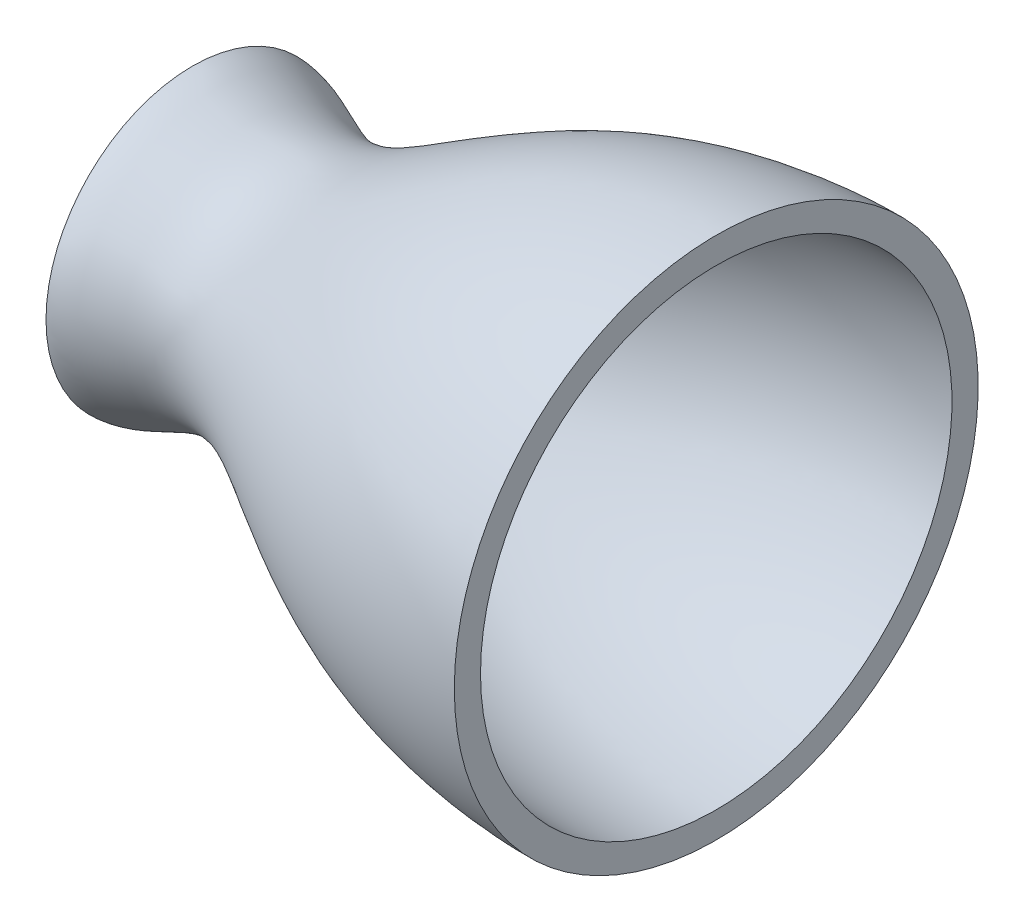
ISO-10303-21;
HEADER;
FILE_DESCRIPTION(('STEP AP214'),'2;1');
FILE_NAME('part.step','',(''),(''),'','','');
FILE_SCHEMA(('AUTOMOTIVE_DESIGN { 1 0 10303 214 1 1 1 1 }'));
ENDSEC;
DATA;
#1=APPLICATION_CONTEXT('core data for automotive mechanical design processes');
#2=APPLICATION_PROTOCOL_DEFINITION('international standard','automotive_design',2000,#1);
#3=PRODUCT_CONTEXT('',#1,'mechanical');
#4=PRODUCT('Part','Part','',(#3));
#5=PRODUCT_RELATED_PRODUCT_CATEGORY('part','',(#4));
#6=PRODUCT_DEFINITION_FORMATION('','',#4);
#7=PRODUCT_DEFINITION_CONTEXT('part definition',#1,'design');
#8=PRODUCT_DEFINITION('design','',#6,#7);
#9=PRODUCT_DEFINITION_SHAPE('','',#8);
#10=(LENGTH_UNIT() NAMED_UNIT(*) SI_UNIT(.MILLI.,.METRE.));
#11=(NAMED_UNIT(*) PLANE_ANGLE_UNIT() SI_UNIT($,.RADIAN.));
#12=(NAMED_UNIT(*) SI_UNIT($,.STERADIAN.) SOLID_ANGLE_UNIT());
#13=UNCERTAINTY_MEASURE_WITH_UNIT(LENGTH_MEASURE(1.E-05),#10,'distance_accuracy_value','');
#14=(GEOMETRIC_REPRESENTATION_CONTEXT(3) GLOBAL_UNCERTAINTY_ASSIGNED_CONTEXT((#13)) GLOBAL_UNIT_ASSIGNED_CONTEXT((#10,
#11,#12)) REPRESENTATION_CONTEXT('',''));
#15=CARTESIAN_POINT('',(0.,0.,0.));
#16=DIRECTION('',(0.,0.,1.));
#17=DIRECTION('',(1.,0.,0.));
#18=AXIS2_PLACEMENT_3D('',#15,#16,#17);
#19=CARTESIAN_POINT('',(0.,0.,0.));
#20=DIRECTION('',(1.,0.,0.));
#21=DIRECTION('',(0.,0.,-1.));
#22=AXIS2_PLACEMENT_3D('',#19,#20,#21);
#23=PLANE('',#22);
#24=CARTESIAN_POINT('',(0.,-139.711392309965,0.));
#25=DIRECTION('',(-1.,0.,0.));
#26=DIRECTION('',(0.,0.,1.));
#27=AXIS2_PLACEMENT_3D('',#24,#25,#26);
#28=CIRCLE('',#27,114.711392309965);
#29=CARTESIAN_POINT('',(0.,-139.711392309965,114.711392309965));
#30=VERTEX_POINT('',#29);
#31=EDGE_CURVE('E10',#30,#30,#28,.T.);
#32=ORIENTED_EDGE('',*,*,#31,.F.);
#33=EDGE_LOOP('',(#32));
#34=FACE_BOUND('',#33,.T.);
#35=CARTESIAN_POINT('',(0.,-139.711392309965,0.));
#36=DIRECTION('',(-1.,0.,0.));
#37=DIRECTION('',(0.,0.,1.));
#38=AXIS2_PLACEMENT_3D('',#35,#36,#37);
#39=CIRCLE('',#38,139.711392309965);
#40=CARTESIAN_POINT('',(0.,-139.711392309965,139.711392309965));
#41=VERTEX_POINT('',#40);
#42=EDGE_CURVE('E53',#41,#41,#39,.T.);
#43=ORIENTED_EDGE('',*,*,#42,.T.);
#44=EDGE_LOOP('',(#43));
#45=FACE_BOUND('',#44,.T.);
#46=ADVANCED_FACE('F39',(#34,#45),#23,.F.);
#47=CARTESIAN_POINT('',(0.,-25.,0.));
#48=CARTESIAN_POINT('',(12.6643638654571,-25.,0.));
#49=CARTESIAN_POINT('',(40.34446452542,-37.4665120604033,0.));
#50=CARTESIAN_POINT('',(102.969698775344,-62.5621982464521,0.));
#51=CARTESIAN_POINT('',(196.570831127585,-5.28074058704592,0.));
#52=CARTESIAN_POINT('',(321.27134137886,64.3056738251009,0.));
#53=CARTESIAN_POINT('',(435.244637533925,85.2886076900353,0.));
#54=CARTESIAN_POINT('',(500.,85.2886076900353,0.));
#55=B_SPLINE_CURVE_WITH_KNOTS('',3,(#47,#48,#49,#50,#51,#52,#53,#54),.UNSPECIFIED.,.F.,.F.,(4,1,
1,1,1,4),(0.,0.0739763507218789,0.164364943374705,0.371180183195593,0.629474053384755,1.),.UNSPECIFIED.);
#56=CARTESIAN_POINT('',(0.,-139.711392309965,0.));
#57=DIRECTION('',(-1.,0.,0.));
#58=AXIS1_PLACEMENT('',#56,#57);
#59=SURFACE_OF_REVOLUTION('',#55,#58);
#60=CARTESIAN_POINT('',(500.,-139.711392309965,0.));
#61=DIRECTION('',(-1.,0.,0.));
#62=DIRECTION('',(0.,0.,1.));
#63=AXIS2_PLACEMENT_3D('',#60,#61,#62);
#64=CIRCLE('',#63,225.);
#65=CARTESIAN_POINT('',(500.,-139.711392309965,225.));
#66=VERTEX_POINT('',#65);
#67=EDGE_CURVE('E45',#66,#66,#64,.T.);
#68=ORIENTED_EDGE('',*,*,#67,.F.);
#69=EDGE_LOOP('',(#68));
#70=FACE_BOUND('',#69,.T.);
#71=ORIENTED_EDGE('',*,*,#31,.T.);
#72=EDGE_LOOP('',(#71));
#73=FACE_BOUND('',#72,.T.);
#74=ADVANCED_FACE('F75',(#70,#73),#59,.T.);
#75=CARTESIAN_POINT('',(500.,0.,0.));
#76=DIRECTION('',(1.,0.,0.));
#77=DIRECTION('',(0.,0.,-1.));
#78=AXIS2_PLACEMENT_3D('',#75,#76,#77);
#79=PLANE('',#78);
#80=ORIENTED_EDGE('',*,*,#67,.T.);
#81=EDGE_LOOP('',(#80));
#82=FACE_BOUND('',#81,.T.);
#83=CARTESIAN_POINT('',(500.,-139.711392309965,0.));
#84=DIRECTION('',(-1.,0.,0.));
#85=DIRECTION('',(0.,0.,1.));
#86=AXIS2_PLACEMENT_3D('',#83,#84,#85);
#87=CIRCLE('',#86,250.);
#88=CARTESIAN_POINT('',(500.,-139.711392309965,250.));
#89=VERTEX_POINT('',#88);
#90=EDGE_CURVE('E49',#89,#89,#87,.T.);
#91=ORIENTED_EDGE('',*,*,#90,.F.);
#92=EDGE_LOOP('',(#91));
#93=FACE_BOUND('',#92,.T.);
#94=ADVANCED_FACE('F72',(#82,#93),#79,.T.);
#95=CARTESIAN_POINT('',(0.,0.,0.));
#96=CARTESIAN_POINT('',(12.6643638654571,0.,0.));
#97=CARTESIAN_POINT('',(40.34446452542,-12.4665120604033,0.));
#98=CARTESIAN_POINT('',(102.969698775344,-37.5621982464521,0.));
#99=CARTESIAN_POINT('',(196.570831127585,19.7192594129541,0.));
#100=CARTESIAN_POINT('',(321.27134137886,89.3056738251009,0.));
#101=CARTESIAN_POINT('',(435.244637533925,110.288607690035,0.));
#102=CARTESIAN_POINT('',(500.,110.288607690035,0.));
#103=B_SPLINE_CURVE_WITH_KNOTS('',3,(#95,#96,#97,#98,#99,#100,#101,#102),.UNSPECIFIED.,.F.,.F.,
(4,1,1,1,1,4),(0.,0.0739763507218789,0.164364943374705,0.371180183195593,0.629474053384755,1.),.UNSPECIFIED.);
#104=CARTESIAN_POINT('',(0.,-139.711392309965,0.));
#105=DIRECTION('',(-1.,0.,0.));
#106=AXIS1_PLACEMENT('',#104,#105);
#107=SURFACE_OF_REVOLUTION('',#103,#106);
#108=ORIENTED_EDGE('',*,*,#90,.T.);
#109=EDGE_LOOP('',(#108));
#110=FACE_BOUND('',#109,.T.);
#111=ORIENTED_EDGE('',*,*,#42,.F.);
#112=EDGE_LOOP('',(#111));
#113=FACE_BOUND('',#112,.T.);
#114=ADVANCED_FACE('F69',(#110,#113),#107,.F.);
#115=CLOSED_SHELL('',(#46,#74,#94,#114));
#116=MANIFOLD_SOLID_BREP('B2',#115);
#117=ADVANCED_BREP_SHAPE_REPRESENTATION('',(#18,#116),#14);
#118=SHAPE_DEFINITION_REPRESENTATION(#9,#117);
ENDSEC;
END-ISO-10303-21;
